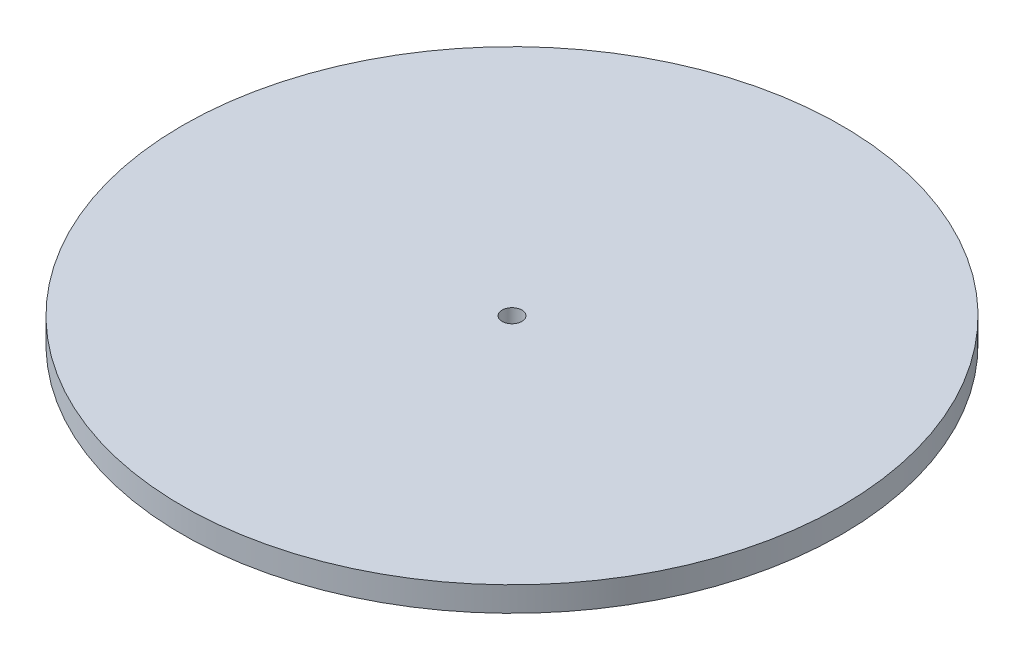
ISO-10303-21;
HEADER;
FILE_DESCRIPTION(('STEP AP214'),'2;1');
FILE_NAME('part.step','',(''),(''),'','','');
FILE_SCHEMA(('AUTOMOTIVE_DESIGN { 1 0 10303 214 1 1 1 1 }'));
ENDSEC;
DATA;
#1=APPLICATION_CONTEXT('core data for automotive mechanical design processes');
#2=APPLICATION_PROTOCOL_DEFINITION('international standard','automotive_design',2000,#1);
#3=PRODUCT_CONTEXT('',#1,'mechanical');
#4=PRODUCT('Part','Part','',(#3));
#5=PRODUCT_RELATED_PRODUCT_CATEGORY('part','',(#4));
#6=PRODUCT_DEFINITION_FORMATION('','',#4);
#7=PRODUCT_DEFINITION_CONTEXT('part definition',#1,'design');
#8=PRODUCT_DEFINITION('design','',#6,#7);
#9=PRODUCT_DEFINITION_SHAPE('','',#8);
#10=(LENGTH_UNIT() NAMED_UNIT(*) SI_UNIT(.MILLI.,.METRE.));
#11=(NAMED_UNIT(*) PLANE_ANGLE_UNIT() SI_UNIT($,.RADIAN.));
#12=(NAMED_UNIT(*) SI_UNIT($,.STERADIAN.) SOLID_ANGLE_UNIT());
#13=UNCERTAINTY_MEASURE_WITH_UNIT(LENGTH_MEASURE(1.E-05),#10,'distance_accuracy_value','');
#14=(GEOMETRIC_REPRESENTATION_CONTEXT(3) GLOBAL_UNCERTAINTY_ASSIGNED_CONTEXT((#13)) GLOBAL_UNIT_ASSIGNED_CONTEXT((#10,
#11,#12)) REPRESENTATION_CONTEXT('',''));
#15=CARTESIAN_POINT('',(0.,0.,0.));
#16=DIRECTION('',(0.,0.,1.));
#17=DIRECTION('',(1.,0.,0.));
#18=AXIS2_PLACEMENT_3D('',#15,#16,#17);
#19=CARTESIAN_POINT('',(0.,13.0946068022603,0.));
#20=DIRECTION('',(0.,1.,0.));
#21=DIRECTION('',(-1.,0.,0.));
#22=AXIS2_PLACEMENT_3D('',#19,#20,#21);
#23=CYLINDRICAL_SURFACE('',#22,40.);
#24=CARTESIAN_POINT('',(0.,13.0946068022603,0.));
#25=DIRECTION('',(0.,1.,0.));
#26=DIRECTION('',(-1.,0.,0.));
#27=AXIS2_PLACEMENT_3D('',#24,#25,#26);
#28=CIRCLE('',#27,40.);
#29=CARTESIAN_POINT('',(-40.,13.0946068022603,0.));
#30=VERTEX_POINT('',#29);
#31=EDGE_CURVE('E50',#30,#30,#28,.T.);
#32=ORIENTED_EDGE('',*,*,#31,.F.);
#33=EDGE_LOOP('',(#32));
#34=FACE_BOUND('',#33,.T.);
#35=CARTESIAN_POINT('',(0.,10.0946068022603,0.));
#36=DIRECTION('',(0.,1.,0.));
#37=DIRECTION('',(-1.,0.,0.));
#38=AXIS2_PLACEMENT_3D('',#35,#36,#37);
#39=CIRCLE('',#38,40.);
#40=CARTESIAN_POINT('',(-40.,10.0946068022603,0.));
#41=VERTEX_POINT('',#40);
#42=EDGE_CURVE('E10',#41,#41,#39,.T.);
#43=ORIENTED_EDGE('',*,*,#42,.T.);
#44=EDGE_LOOP('',(#43));
#45=FACE_BOUND('',#44,.T.);
#46=ADVANCED_FACE('F31',(#34,#45),#23,.T.);
#47=CARTESIAN_POINT('',(37.,10.0946068022603,0.));
#48=DIRECTION('',(0.,1.,0.));
#49=DIRECTION('',(-1.,0.,0.));
#50=AXIS2_PLACEMENT_3D('',#47,#48,#49);
#51=PLANE('',#50);
#52=ORIENTED_EDGE('',*,*,#42,.F.);
#53=EDGE_LOOP('',(#52));
#54=FACE_BOUND('',#53,.T.);
#55=CARTESIAN_POINT('',(0.,10.0946068022603,0.));
#56=DIRECTION('',(0.,1.,0.));
#57=DIRECTION('',(-1.,0.,0.));
#58=AXIS2_PLACEMENT_3D('',#55,#56,#57);
#59=CIRCLE('',#58,37.);
#60=CARTESIAN_POINT('',(-37.,10.0946068022603,0.));
#61=VERTEX_POINT('',#60);
#62=EDGE_CURVE('E37',#61,#61,#59,.T.);
#63=ORIENTED_EDGE('',*,*,#62,.T.);
#64=EDGE_LOOP('',(#63));
#65=FACE_BOUND('',#64,.T.);
#66=ADVANCED_FACE('F71',(#54,#65),#51,.F.);
#67=CARTESIAN_POINT('',(0.,13.0946068022603,0.));
#68=DIRECTION('',(0.,1.,0.));
#69=DIRECTION('',(-1.,0.,0.));
#70=AXIS2_PLACEMENT_3D('',#67,#68,#69);
#71=CYLINDRICAL_SURFACE('',#70,36.9999999999996);
#72=ORIENTED_EDGE('',*,*,#62,.F.);
#73=EDGE_LOOP('',(#72));
#74=FACE_BOUND('',#73,.T.);
#75=CARTESIAN_POINT('',(0.,9.09460680226001,0.));
#76=DIRECTION('',(0.,1.,0.));
#77=DIRECTION('',(-1.,0.,0.));
#78=AXIS2_PLACEMENT_3D('',#75,#76,#77);
#79=CIRCLE('',#78,36.9999999999991);
#80=CARTESIAN_POINT('',(-36.9999999999991,9.09460680226001,0.));
#81=VERTEX_POINT('',#80);
#82=EDGE_CURVE('E41',#81,#81,#79,.T.);
#83=ORIENTED_EDGE('',*,*,#82,.T.);
#84=EDGE_LOOP('',(#83));
#85=FACE_BOUND('',#84,.T.);
#86=ADVANCED_FACE('F67',(#74,#85),#71,.T.);
#87=CARTESIAN_POINT('',(-1.73917629429921E-10,0.,0.));
#88=CARTESIAN_POINT('',(4.62499999995913,0.00135963132715665,0.));
#89=CARTESIAN_POINT('',(9.25000000003224,0.613543177615852,0.));
#90=CARTESIAN_POINT('',(13.8750000000389,1.9035148561219,0.));
#91=CARTESIAN_POINT('',(18.5000000000421,3.22750362077868,0.));
#92=CARTESIAN_POINT('',(23.1250000000308,4.69972359722798,0.));
#93=CARTESIAN_POINT('',(27.7500000000202,6.16536142620251,0.));
#94=CARTESIAN_POINT('',(32.3750000000088,7.63915160097252,0.));
#95=CARTESIAN_POINT('',(36.9999999999991,9.09460680226001,0.));
#96=B_SPLINE_CURVE_WITH_KNOTS('',8,(#87,#88,#89,#90,#91,#92,#93,#94,#95),.UNSPECIFIED.,.F.,.F.,
(9,9),(0.083434196845013,0.917776165436825),.UNSPECIFIED.);
#97=CARTESIAN_POINT('',(0.,13.0946068022603,0.));
#98=DIRECTION('',(0.,1.,0.));
#99=AXIS1_PLACEMENT('',#97,#98);
#100=SURFACE_OF_REVOLUTION('',#96,#99);
#101=CARTESIAN_POINT('',(0.,0.0184186043253511,0.));
#102=DIRECTION('',(0.,1.,0.));
#103=DIRECTION('',(-1.,0.,0.));
#104=AXIS2_PLACEMENT_3D('',#101,#102,#103);
#105=CIRCLE('',#104,1.2);
#106=CARTESIAN_POINT('',(-1.2,0.0184186043253511,0.));
#107=VERTEX_POINT('',#106);
#108=EDGE_CURVE('E53',#107,#107,#105,.T.);
#109=ORIENTED_EDGE('',*,*,#108,.T.);
#110=EDGE_LOOP('',(#109));
#111=FACE_BOUND('',#110,.T.);
#112=ORIENTED_EDGE('',*,*,#82,.F.);
#113=EDGE_LOOP('',(#112));
#114=FACE_BOUND('',#113,.T.);
#115=ADVANCED_FACE('F62',(#111,#114),#100,.T.);
#116=CARTESIAN_POINT('',(0.,13.0946068022603,0.));
#117=DIRECTION('',(0.,1.,0.));
#118=DIRECTION('',(-1.,0.,0.));
#119=AXIS2_PLACEMENT_3D('',#116,#117,#118);
#120=CYLINDRICAL_SURFACE('',#119,1.2);
#121=CARTESIAN_POINT('',(0.,13.0946068022603,0.));
#122=DIRECTION('',(0.,1.,0.));
#123=DIRECTION('',(-1.,0.,0.));
#124=AXIS2_PLACEMENT_3D('',#121,#122,#123);
#125=CIRCLE('',#124,1.2);
#126=CARTESIAN_POINT('',(-1.2,13.0946068022603,0.));
#127=VERTEX_POINT('',#126);
#128=EDGE_CURVE('E45',#127,#127,#125,.T.);
#129=ORIENTED_EDGE('',*,*,#128,.T.);
#130=EDGE_LOOP('',(#129));
#131=FACE_BOUND('',#130,.T.);
#132=ORIENTED_EDGE('',*,*,#108,.F.);
#133=EDGE_LOOP('',(#132));
#134=FACE_BOUND('',#133,.T.);
#135=ADVANCED_FACE('F66',(#131,#134),#120,.F.);
#136=CARTESIAN_POINT('',(40.,13.0946068022603,0.));
#137=DIRECTION('',(0.,-1.,0.));
#138=DIRECTION('',(1.,0.,0.));
#139=AXIS2_PLACEMENT_3D('',#136,#137,#138);
#140=PLANE('',#139);
#141=ORIENTED_EDGE('',*,*,#128,.F.);
#142=EDGE_LOOP('',(#141));
#143=FACE_BOUND('',#142,.T.);
#144=ORIENTED_EDGE('',*,*,#31,.T.);
#145=EDGE_LOOP('',(#144));
#146=FACE_BOUND('',#145,.T.);
#147=ADVANCED_FACE('F83',(#143,#146),#140,.F.);
#148=CLOSED_SHELL('',(#46,#66,#86,#115,#135,#147));
#149=MANIFOLD_SOLID_BREP('B2',#148);
#150=ADVANCED_BREP_SHAPE_REPRESENTATION('',(#18,#149),#14);
#151=SHAPE_DEFINITION_REPRESENTATION(#9,#150);
ENDSEC;
END-ISO-10303-21;
